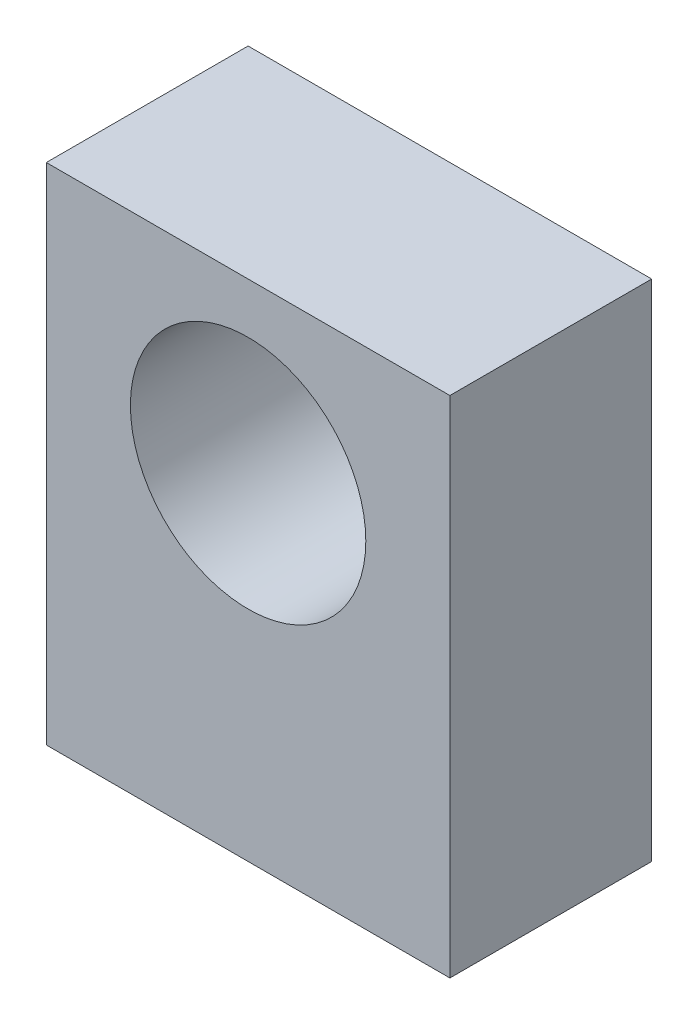
ISO-10303-21;
HEADER;
FILE_DESCRIPTION(('STEP AP214'),'2;1');
FILE_NAME('part.step','',(''),(''),'','','');
FILE_SCHEMA(('AUTOMOTIVE_DESIGN { 1 0 10303 214 1 1 1 1 }'));
ENDSEC;
DATA;
#1=APPLICATION_CONTEXT('core data for automotive mechanical design processes');
#2=APPLICATION_PROTOCOL_DEFINITION('international standard','automotive_design',2000,#1);
#3=PRODUCT_CONTEXT('',#1,'mechanical');
#4=PRODUCT('Part','Part','',(#3));
#5=PRODUCT_RELATED_PRODUCT_CATEGORY('part','',(#4));
#6=PRODUCT_DEFINITION_FORMATION('','',#4);
#7=PRODUCT_DEFINITION_CONTEXT('part definition',#1,'design');
#8=PRODUCT_DEFINITION('design','',#6,#7);
#9=PRODUCT_DEFINITION_SHAPE('','',#8);
#10=(LENGTH_UNIT() NAMED_UNIT(*) SI_UNIT(.MILLI.,.METRE.));
#11=(NAMED_UNIT(*) PLANE_ANGLE_UNIT() SI_UNIT($,.RADIAN.));
#12=(NAMED_UNIT(*) SI_UNIT($,.STERADIAN.) SOLID_ANGLE_UNIT());
#13=UNCERTAINTY_MEASURE_WITH_UNIT(LENGTH_MEASURE(1.E-05),#10,'distance_accuracy_value','');
#14=(GEOMETRIC_REPRESENTATION_CONTEXT(3) GLOBAL_UNCERTAINTY_ASSIGNED_CONTEXT((#13)) GLOBAL_UNIT_ASSIGNED_CONTEXT((#10,
#11,#12)) REPRESENTATION_CONTEXT('',''));
#15=CARTESIAN_POINT('',(0.,0.,0.));
#16=DIRECTION('',(0.,0.,1.));
#17=DIRECTION('',(1.,0.,0.));
#18=AXIS2_PLACEMENT_3D('',#15,#16,#17);
#19=CARTESIAN_POINT('',(0.,42.75,3.));
#20=DIRECTION('',(0.,-1.,0.));
#21=DIRECTION('',(0.,0.,-1.));
#22=AXIS2_PLACEMENT_3D('',#19,#20,#21);
#23=PLANE('',#22);
#24=DIRECTION('',(-1.,0.,0.));
#25=VECTOR('',#24,1.);
#26=CARTESIAN_POINT('',(0.,42.75,0.));
#27=LINE('',#26,#25);
#28=CARTESIAN_POINT('',(-63.7499999999999,42.75,0.));
#29=VERTEX_POINT('',#28);
#30=CARTESIAN_POINT('',(-69.75,42.75,0.));
#31=VERTEX_POINT('',#30);
#32=EDGE_CURVE('E106',#29,#31,#27,.T.);
#33=ORIENTED_EDGE('',*,*,#32,.F.);
#34=DIRECTION('',(0.,0.,-1.));
#35=VECTOR('',#34,1.);
#36=CARTESIAN_POINT('',(-63.7499999999999,42.75,3.));
#37=LINE('',#36,#35);
#38=CARTESIAN_POINT('',(-63.7499999999999,42.75,3.));
#39=VERTEX_POINT('',#38);
#40=EDGE_CURVE('E11',#39,#29,#37,.T.);
#41=ORIENTED_EDGE('',*,*,#40,.F.);
#42=DIRECTION('',(-1.,0.,0.));
#43=VECTOR('',#42,1.);
#44=CARTESIAN_POINT('',(0.,42.75,3.));
#45=LINE('',#44,#43);
#46=CARTESIAN_POINT('',(-69.75,42.75,3.));
#47=VERTEX_POINT('',#46);
#48=EDGE_CURVE('E92',#39,#47,#45,.T.);
#49=ORIENTED_EDGE('',*,*,#48,.T.);
#50=DIRECTION('',(0.,0.,-1.));
#51=VECTOR('',#50,1.);
#52=CARTESIAN_POINT('',(-69.75,42.75,3.));
#53=LINE('',#52,#51);
#54=EDGE_CURVE('E74',#47,#31,#53,.T.);
#55=ORIENTED_EDGE('',*,*,#54,.T.);
#56=EDGE_LOOP('',(#33,#41,#49,#55));
#57=FACE_BOUND('',#56,.T.);
#58=ADVANCED_FACE('F35',(#57),#23,.T.);
#59=CARTESIAN_POINT('',(-63.7499999999999,0.,3.));
#60=DIRECTION('',(-1.,0.,0.));
#61=DIRECTION('',(0.,0.,1.));
#62=AXIS2_PLACEMENT_3D('',#59,#60,#61);
#63=PLANE('',#62);
#64=DIRECTION('',(0.,1.,0.));
#65=VECTOR('',#64,1.);
#66=CARTESIAN_POINT('',(-63.7499999999999,0.,0.));
#67=LINE('',#66,#65);
#68=CARTESIAN_POINT('',(-63.7499999999999,50.25,0.));
#69=VERTEX_POINT('',#68);
#70=EDGE_CURVE('E97',#29,#69,#67,.T.);
#71=ORIENTED_EDGE('',*,*,#70,.T.);
#72=DIRECTION('',(0.,0.,-1.));
#73=VECTOR('',#72,1.);
#74=CARTESIAN_POINT('',(-63.7499999999999,50.25,3.));
#75=LINE('',#74,#73);
#76=CARTESIAN_POINT('',(-63.7499999999999,50.25,3.));
#77=VERTEX_POINT('',#76);
#78=EDGE_CURVE('E44',#77,#69,#75,.T.);
#79=ORIENTED_EDGE('',*,*,#78,.F.);
#80=DIRECTION('',(0.,1.,0.));
#81=VECTOR('',#80,1.);
#82=CARTESIAN_POINT('',(-63.7499999999999,0.,3.));
#83=LINE('',#82,#81);
#84=EDGE_CURVE('E89',#39,#77,#83,.T.);
#85=ORIENTED_EDGE('',*,*,#84,.F.);
#86=ORIENTED_EDGE('',*,*,#40,.T.);
#87=EDGE_LOOP('',(#71,#79,#85,#86));
#88=FACE_BOUND('',#87,.T.);
#89=ADVANCED_FACE('F95',(#88),#63,.F.);
#90=CARTESIAN_POINT('',(0.,50.25,3.));
#91=DIRECTION('',(0.,-1.,0.));
#92=DIRECTION('',(0.,0.,-1.));
#93=AXIS2_PLACEMENT_3D('',#90,#91,#92);
#94=PLANE('',#93);
#95=DIRECTION('',(-1.,0.,0.));
#96=VECTOR('',#95,1.);
#97=CARTESIAN_POINT('',(0.,50.25,0.));
#98=LINE('',#97,#96);
#99=CARTESIAN_POINT('',(-69.75,50.25,0.));
#100=VERTEX_POINT('',#99);
#101=EDGE_CURVE('E103',#69,#100,#98,.T.);
#102=ORIENTED_EDGE('',*,*,#101,.T.);
#103=DIRECTION('',(0.,0.,-1.));
#104=VECTOR('',#103,1.);
#105=CARTESIAN_POINT('',(-69.75,50.25,3.));
#106=LINE('',#105,#104);
#107=CARTESIAN_POINT('',(-69.75,50.25,3.));
#108=VERTEX_POINT('',#107);
#109=EDGE_CURVE('E88',#108,#100,#106,.T.);
#110=ORIENTED_EDGE('',*,*,#109,.F.);
#111=DIRECTION('',(-1.,0.,0.));
#112=VECTOR('',#111,1.);
#113=CARTESIAN_POINT('',(0.,50.25,3.));
#114=LINE('',#113,#112);
#115=EDGE_CURVE('E82',#77,#108,#114,.T.);
#116=ORIENTED_EDGE('',*,*,#115,.F.);
#117=ORIENTED_EDGE('',*,*,#78,.T.);
#118=EDGE_LOOP('',(#102,#110,#116,#117));
#119=FACE_BOUND('',#118,.T.);
#120=ADVANCED_FACE('F85',(#119),#94,.F.);
#121=CARTESIAN_POINT('',(-66.7499999999999,47.75,3.));
#122=DIRECTION('',(0.,0.,-1.));
#123=DIRECTION('',(-1.,0.,0.));
#124=AXIS2_PLACEMENT_3D('',#121,#122,#123);
#125=CYLINDRICAL_SURFACE('',#124,1.75);
#126=CARTESIAN_POINT('',(-66.7499999999999,47.75,3.));
#127=DIRECTION('',(0.,0.,1.));
#128=DIRECTION('',(1.,0.,0.));
#129=AXIS2_PLACEMENT_3D('',#126,#127,#128);
#130=CIRCLE('',#129,1.75);
#131=CARTESIAN_POINT('',(-64.9999999999999,47.75,3.));
#132=VERTEX_POINT('',#131);
#133=EDGE_CURVE('E102',#132,#132,#130,.T.);
#134=ORIENTED_EDGE('',*,*,#133,.T.);
#135=EDGE_LOOP('',(#134));
#136=FACE_BOUND('',#135,.T.);
#137=CARTESIAN_POINT('',(-66.7499999999999,47.75,0.));
#138=DIRECTION('',(0.,0.,1.));
#139=DIRECTION('',(1.,0.,0.));
#140=AXIS2_PLACEMENT_3D('',#137,#138,#139);
#141=CIRCLE('',#140,1.75);
#142=CARTESIAN_POINT('',(-64.9999999999999,47.75,0.));
#143=VERTEX_POINT('',#142);
#144=EDGE_CURVE('E108',#143,#143,#141,.T.);
#145=ORIENTED_EDGE('',*,*,#144,.F.);
#146=EDGE_LOOP('',(#145));
#147=FACE_BOUND('',#146,.T.);
#148=ADVANCED_FACE('F37',(#136,#147),#125,.F.);
#149=CARTESIAN_POINT('',(-69.75,0.,3.));
#150=DIRECTION('',(1.,0.,0.));
#151=DIRECTION('',(0.,0.,-1.));
#152=AXIS2_PLACEMENT_3D('',#149,#150,#151);
#153=PLANE('',#152);
#154=DIRECTION('',(0.,-1.,0.));
#155=VECTOR('',#154,1.);
#156=CARTESIAN_POINT('',(-69.75,0.,0.));
#157=LINE('',#156,#155);
#158=EDGE_CURVE('E67',#100,#31,#157,.T.);
#159=ORIENTED_EDGE('',*,*,#158,.T.);
#160=ORIENTED_EDGE('',*,*,#54,.F.);
#161=DIRECTION('',(0.,-1.,0.));
#162=VECTOR('',#161,1.);
#163=CARTESIAN_POINT('',(-69.75,0.,3.));
#164=LINE('',#163,#162);
#165=EDGE_CURVE('E52',#108,#47,#164,.T.);
#166=ORIENTED_EDGE('',*,*,#165,.F.);
#167=ORIENTED_EDGE('',*,*,#109,.T.);
#168=EDGE_LOOP('',(#159,#160,#166,#167));
#169=FACE_BOUND('',#168,.T.);
#170=ADVANCED_FACE('F120',(#169),#153,.F.);
#171=CARTESIAN_POINT('',(0.,0.,3.));
#172=DIRECTION('',(0.,0.,1.));
#173=DIRECTION('',(1.,0.,0.));
#174=AXIS2_PLACEMENT_3D('',#171,#172,#173);
#175=PLANE('',#174);
#176=ORIENTED_EDGE('',*,*,#133,.F.);
#177=EDGE_LOOP('',(#176));
#178=FACE_BOUND('',#177,.T.);
#179=ORIENTED_EDGE('',*,*,#48,.F.);
#180=ORIENTED_EDGE('',*,*,#84,.T.);
#181=ORIENTED_EDGE('',*,*,#115,.T.);
#182=ORIENTED_EDGE('',*,*,#165,.T.);
#183=EDGE_LOOP('',(#179,#180,#181,#182));
#184=FACE_BOUND('',#183,.T.);
#185=ADVANCED_FACE('F91',(#178,#184),#175,.T.);
#186=CARTESIAN_POINT('',(0.,0.,0.));
#187=DIRECTION('',(0.,0.,1.));
#188=DIRECTION('',(1.,0.,0.));
#189=AXIS2_PLACEMENT_3D('',#186,#187,#188);
#190=PLANE('',#189);
#191=ORIENTED_EDGE('',*,*,#144,.T.);
#192=EDGE_LOOP('',(#191));
#193=FACE_BOUND('',#192,.T.);
#194=ORIENTED_EDGE('',*,*,#32,.T.);
#195=ORIENTED_EDGE('',*,*,#158,.F.);
#196=ORIENTED_EDGE('',*,*,#101,.F.);
#197=ORIENTED_EDGE('',*,*,#70,.F.);
#198=EDGE_LOOP('',(#194,#195,#196,#197));
#199=FACE_BOUND('',#198,.T.);
#200=ADVANCED_FACE('F119',(#193,#199),#190,.F.);
#201=CLOSED_SHELL('',(#58,#89,#120,#148,#170,#185,#200));
#202=MANIFOLD_SOLID_BREP('B2',#201);
#203=ADVANCED_BREP_SHAPE_REPRESENTATION('',(#18,#202),#14);
#204=SHAPE_DEFINITION_REPRESENTATION(#9,#203);
ENDSEC;
END-ISO-10303-21;
